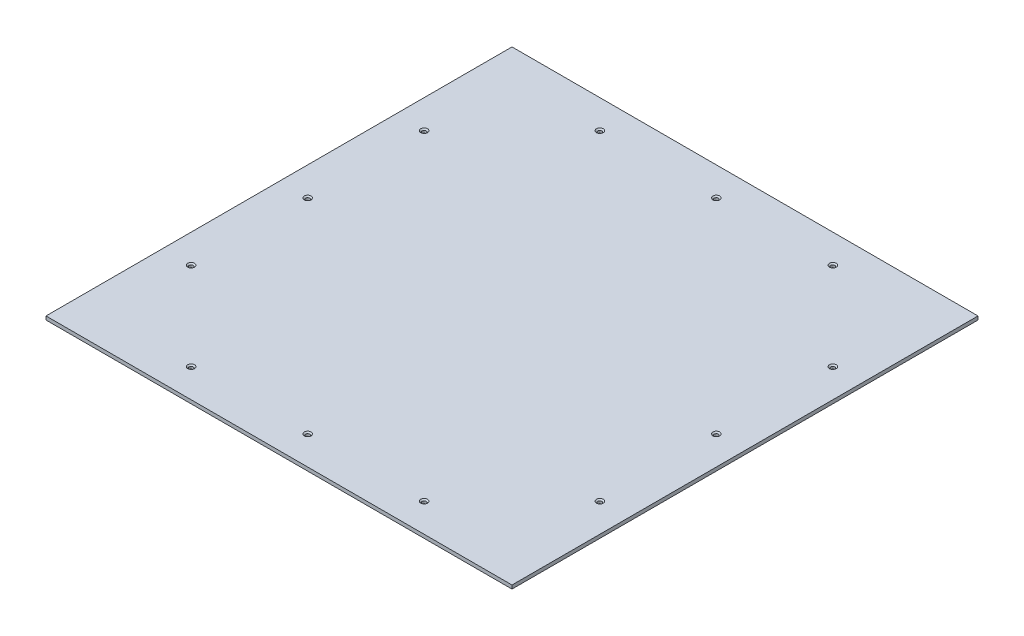
ISO-10303-21;
HEADER;
FILE_DESCRIPTION(('STEP AP214'),'2;1');
FILE_NAME('part.step','',(''),(''),'','','');
FILE_SCHEMA(('AUTOMOTIVE_DESIGN { 1 0 10303 214 1 1 1 1 }'));
ENDSEC;
DATA;
#1=APPLICATION_CONTEXT('core data for automotive mechanical design processes');
#2=APPLICATION_PROTOCOL_DEFINITION('international standard','automotive_design',2000,#1);
#3=PRODUCT_CONTEXT('',#1,'mechanical');
#4=PRODUCT('Part','Part','',(#3));
#5=PRODUCT_RELATED_PRODUCT_CATEGORY('part','',(#4));
#6=PRODUCT_DEFINITION_FORMATION('','',#4);
#7=PRODUCT_DEFINITION_CONTEXT('part definition',#1,'design');
#8=PRODUCT_DEFINITION('design','',#6,#7);
#9=PRODUCT_DEFINITION_SHAPE('','',#8);
#10=(LENGTH_UNIT() NAMED_UNIT(*) SI_UNIT(.MILLI.,.METRE.));
#11=(NAMED_UNIT(*) PLANE_ANGLE_UNIT() SI_UNIT($,.RADIAN.));
#12=(NAMED_UNIT(*) SI_UNIT($,.STERADIAN.) SOLID_ANGLE_UNIT());
#13=UNCERTAINTY_MEASURE_WITH_UNIT(LENGTH_MEASURE(1.E-05),#10,'distance_accuracy_value','');
#14=(GEOMETRIC_REPRESENTATION_CONTEXT(3) GLOBAL_UNCERTAINTY_ASSIGNED_CONTEXT((#13)) GLOBAL_UNIT_ASSIGNED_CONTEXT((#10,
#11,#12)) REPRESENTATION_CONTEXT('',''));
#15=CARTESIAN_POINT('',(0.,0.,0.));
#16=DIRECTION('',(0.,0.,1.));
#17=DIRECTION('',(1.,0.,0.));
#18=AXIS2_PLACEMENT_3D('',#15,#16,#17);
#19=CARTESIAN_POINT('',(103.375714,114.488214,103.375714));
#20=DIRECTION('',(1.,0.,0.));
#21=DIRECTION('',(0.,0.,1.));
#22=AXIS2_PLACEMENT_3D('',#19,#20,#21);
#23=PLANE('',#22);
#24=DIRECTION('',(0.,0.,1.));
#25=VECTOR('',#24,1.);
#26=CARTESIAN_POINT('',(103.375714,112.900714,103.375714));
#27=LINE('',#26,#25);
#28=CARTESIAN_POINT('',(103.375714,112.900714,-103.375714));
#29=VERTEX_POINT('',#28);
#30=CARTESIAN_POINT('',(103.375714,112.900714,103.375714));
#31=VERTEX_POINT('',#30);
#32=EDGE_CURVE('E82',#29,#31,#27,.T.);
#33=ORIENTED_EDGE('',*,*,#32,.F.);
#34=DIRECTION('',(0.,-1.,0.));
#35=VECTOR('',#34,1.);
#36=CARTESIAN_POINT('',(103.375714,114.488214,-103.375714));
#37=LINE('',#36,#35);
#38=CARTESIAN_POINT('',(103.375714,114.488214,-103.375714));
#39=VERTEX_POINT('',#38);
#40=EDGE_CURVE('E11',#39,#29,#37,.T.);
#41=ORIENTED_EDGE('',*,*,#40,.F.);
#42=DIRECTION('',(0.,0.,1.));
#43=VECTOR('',#42,1.);
#44=CARTESIAN_POINT('',(103.375714,114.488214,103.375714));
#45=LINE('',#44,#43);
#46=CARTESIAN_POINT('',(103.375714,114.488214,103.375714));
#47=VERTEX_POINT('',#46);
#48=EDGE_CURVE('E75',#39,#47,#45,.T.);
#49=ORIENTED_EDGE('',*,*,#48,.T.);
#50=DIRECTION('',(0.,-1.,0.));
#51=VECTOR('',#50,1.);
#52=CARTESIAN_POINT('',(103.375714,114.488214,103.375714));
#53=LINE('',#52,#51);
#54=EDGE_CURVE('E20',#47,#31,#53,.T.);
#55=ORIENTED_EDGE('',*,*,#54,.T.);
#56=EDGE_LOOP('',(#33,#41,#49,#55));
#57=FACE_BOUND('',#56,.T.);
#58=ADVANCED_FACE('F17',(#57),#23,.T.);
#59=CARTESIAN_POINT('',(103.375714,114.488214,-103.375714));
#60=DIRECTION('',(0.,0.,-1.));
#61=DIRECTION('',(1.,0.,0.));
#62=AXIS2_PLACEMENT_3D('',#59,#60,#61);
#63=PLANE('',#62);
#64=DIRECTION('',(1.,0.,0.));
#65=VECTOR('',#64,1.);
#66=CARTESIAN_POINT('',(103.375714,112.900714,-103.375714));
#67=LINE('',#66,#65);
#68=CARTESIAN_POINT('',(-103.375714,112.900714,-103.375714));
#69=VERTEX_POINT('',#68);
#70=EDGE_CURVE('E77',#69,#29,#67,.T.);
#71=ORIENTED_EDGE('',*,*,#70,.F.);
#72=DIRECTION('',(0.,-1.,0.));
#73=VECTOR('',#72,1.);
#74=CARTESIAN_POINT('',(-103.375714,114.488214,-103.375714));
#75=LINE('',#74,#73);
#76=CARTESIAN_POINT('',(-103.375714,114.488214,-103.375714));
#77=VERTEX_POINT('',#76);
#78=EDGE_CURVE('E26',#77,#69,#75,.T.);
#79=ORIENTED_EDGE('',*,*,#78,.F.);
#80=DIRECTION('',(1.,0.,0.));
#81=VECTOR('',#80,1.);
#82=CARTESIAN_POINT('',(103.375714,114.488214,-103.375714));
#83=LINE('',#82,#81);
#84=EDGE_CURVE('E72',#77,#39,#83,.T.);
#85=ORIENTED_EDGE('',*,*,#84,.T.);
#86=ORIENTED_EDGE('',*,*,#40,.T.);
#87=EDGE_LOOP('',(#71,#79,#85,#86));
#88=FACE_BOUND('',#87,.T.);
#89=ADVANCED_FACE('F93',(#88),#63,.T.);
#90=CARTESIAN_POINT('',(-103.375714,114.488214,103.375714));
#91=DIRECTION('',(-1.,0.,0.));
#92=DIRECTION('',(0.,0.,-1.));
#93=AXIS2_PLACEMENT_3D('',#90,#91,#92);
#94=PLANE('',#93);
#95=DIRECTION('',(0.,0.,-1.));
#96=VECTOR('',#95,1.);
#97=CARTESIAN_POINT('',(-103.375714,112.900714,103.375714));
#98=LINE('',#97,#96);
#99=CARTESIAN_POINT('',(-103.375714,112.900714,103.375714));
#100=VERTEX_POINT('',#99);
#101=EDGE_CURVE('E67',#100,#69,#98,.T.);
#102=ORIENTED_EDGE('',*,*,#101,.F.);
#103=DIRECTION('',(0.,-1.,0.));
#104=VECTOR('',#103,1.);
#105=CARTESIAN_POINT('',(-103.375714,114.488214,103.375714));
#106=LINE('',#105,#104);
#107=CARTESIAN_POINT('',(-103.375714,114.488214,103.375714));
#108=VERTEX_POINT('',#107);
#109=EDGE_CURVE('E62',#108,#100,#106,.T.);
#110=ORIENTED_EDGE('',*,*,#109,.F.);
#111=DIRECTION('',(0.,0.,-1.));
#112=VECTOR('',#111,1.);
#113=CARTESIAN_POINT('',(-103.375714,114.488214,103.375714));
#114=LINE('',#113,#112);
#115=EDGE_CURVE('E65',#108,#77,#114,.T.);
#116=ORIENTED_EDGE('',*,*,#115,.T.);
#117=ORIENTED_EDGE('',*,*,#78,.T.);
#118=EDGE_LOOP('',(#102,#110,#116,#117));
#119=FACE_BOUND('',#118,.T.);
#120=ADVANCED_FACE('F64',(#119),#94,.T.);
#121=CARTESIAN_POINT('',(103.375714,114.488214,103.375714));
#122=DIRECTION('',(0.,0.,1.));
#123=DIRECTION('',(-1.,0.,0.));
#124=AXIS2_PLACEMENT_3D('',#121,#122,#123);
#125=PLANE('',#124);
#126=DIRECTION('',(-1.,0.,0.));
#127=VECTOR('',#126,1.);
#128=CARTESIAN_POINT('',(103.375714,112.900714,103.375714));
#129=LINE('',#128,#127);
#130=EDGE_CURVE('E85',#31,#100,#129,.T.);
#131=ORIENTED_EDGE('',*,*,#130,.F.);
#132=ORIENTED_EDGE('',*,*,#54,.F.);
#133=DIRECTION('',(-1.,0.,0.));
#134=VECTOR('',#133,1.);
#135=CARTESIAN_POINT('',(103.375714,114.488214,103.375714));
#136=LINE('',#135,#134);
#137=EDGE_CURVE('E71',#47,#108,#136,.T.);
#138=ORIENTED_EDGE('',*,*,#137,.T.);
#139=ORIENTED_EDGE('',*,*,#109,.T.);
#140=EDGE_LOOP('',(#131,#132,#138,#139));
#141=FACE_BOUND('',#140,.T.);
#142=ADVANCED_FACE('F74',(#141),#125,.T.);
#143=CARTESIAN_POINT('',(103.375714,114.488214,-103.375714));
#144=DIRECTION('',(0.,1.,0.));
#145=DIRECTION('',(0.,0.,-1.));
#146=AXIS2_PLACEMENT_3D('',#143,#144,#145);
#147=PLANE('',#146);
#148=CARTESIAN_POINT('',(-90.6757140000005,114.488214,51.6878569999991));
#149=DIRECTION('',(0.,1.,0.));
#150=DIRECTION('',(0.,0.,-1.));
#151=AXIS2_PLACEMENT_3D('',#148,#149,#150);
#152=CIRCLE('',#151,1.51130000000001);
#153=CARTESIAN_POINT('',(-90.6757140000005,114.488214,50.1765569999991));
#154=VERTEX_POINT('',#153);
#155=EDGE_CURVE('E222',#154,#154,#152,.T.);
#156=ORIENTED_EDGE('',*,*,#155,.F.);
#157=EDGE_LOOP('',(#156));
#158=FACE_BOUND('',#157,.T.);
#159=CARTESIAN_POINT('',(-90.675714,114.488214,-9.36190769008373E-13));
#160=DIRECTION('',(0.,1.,0.));
#161=DIRECTION('',(0.,0.,-1.));
#162=AXIS2_PLACEMENT_3D('',#159,#160,#161);
#163=CIRCLE('',#162,1.51129999999999);
#164=CARTESIAN_POINT('',(-90.675714,114.488214,-1.51130000000093));
#165=VERTEX_POINT('',#164);
#166=EDGE_CURVE('E229',#165,#165,#163,.T.);
#167=ORIENTED_EDGE('',*,*,#166,.F.);
#168=EDGE_LOOP('',(#167));
#169=FACE_BOUND('',#168,.T.);
#170=CARTESIAN_POINT('',(-90.6757139999995,114.488214,-51.687857000001));
#171=DIRECTION('',(0.,1.,0.));
#172=DIRECTION('',(0.,0.,-1.));
#173=AXIS2_PLACEMENT_3D('',#170,#171,#172);
#174=CIRCLE('',#173,1.51129999999999);
#175=CARTESIAN_POINT('',(-90.6757139999995,114.488214,-53.1991570000009));
#176=VERTEX_POINT('',#175);
#177=EDGE_CURVE('E238',#176,#176,#174,.T.);
#178=ORIENTED_EDGE('',*,*,#177,.F.);
#179=EDGE_LOOP('',(#178));
#180=FACE_BOUND('',#179,.T.);
#181=CARTESIAN_POINT('',(51.6878569999994,114.488214,90.6757140000004));
#182=DIRECTION('',(0.,1.,0.));
#183=DIRECTION('',(0.,0.,-1.));
#184=AXIS2_PLACEMENT_3D('',#181,#182,#183);
#185=CIRCLE('',#184,1.5113);
#186=CARTESIAN_POINT('',(51.6878569999994,114.488214,89.1644140000004));
#187=VERTEX_POINT('',#186);
#188=EDGE_CURVE('E247',#187,#187,#185,.T.);
#189=ORIENTED_EDGE('',*,*,#188,.F.);
#190=EDGE_LOOP('',(#189));
#191=FACE_BOUND('',#190,.T.);
#192=CARTESIAN_POINT('',(-6.1959802232066E-13,114.488214,90.675714));
#193=DIRECTION('',(0.,1.,0.));
#194=DIRECTION('',(0.,0.,-1.));
#195=AXIS2_PLACEMENT_3D('',#192,#193,#194);
#196=CIRCLE('',#195,1.5113);
#197=CARTESIAN_POINT('',(-6.1959802232066E-13,114.488214,89.164414));
#198=VERTEX_POINT('',#197);
#199=EDGE_CURVE('E256',#198,#198,#196,.T.);
#200=ORIENTED_EDGE('',*,*,#199,.F.);
#201=EDGE_LOOP('',(#200));
#202=FACE_BOUND('',#201,.T.);
#203=CARTESIAN_POINT('',(-51.6878570000006,114.488214,90.6757139999997));
#204=DIRECTION('',(0.,1.,0.));
#205=DIRECTION('',(0.,0.,-1.));
#206=AXIS2_PLACEMENT_3D('',#203,#204,#205);
#207=CIRCLE('',#206,1.5113);
#208=CARTESIAN_POINT('',(-51.6878570000006,114.488214,89.1644139999997));
#209=VERTEX_POINT('',#208);
#210=EDGE_CURVE('E265',#209,#209,#207,.T.);
#211=ORIENTED_EDGE('',*,*,#210,.F.);
#212=EDGE_LOOP('',(#211));
#213=FACE_BOUND('',#212,.T.);
#214=CARTESIAN_POINT('',(90.6757140000002,114.488214,-51.6878569999997));
#215=DIRECTION('',(0.,1.,0.));
#216=DIRECTION('',(0.,0.,-1.));
#217=AXIS2_PLACEMENT_3D('',#214,#215,#216);
#218=CIRCLE('',#217,1.51130000000001);
#219=CARTESIAN_POINT('',(90.6757140000002,114.488214,-53.1991569999997));
#220=VERTEX_POINT('',#219);
#221=EDGE_CURVE('E274',#220,#220,#218,.T.);
#222=ORIENTED_EDGE('',*,*,#221,.F.);
#223=EDGE_LOOP('',(#222));
#224=FACE_BOUND('',#223,.T.);
#225=CARTESIAN_POINT('',(90.675714,114.488214,3.03005275632947E-13));
#226=DIRECTION('',(0.,1.,0.));
#227=DIRECTION('',(0.,0.,-1.));
#228=AXIS2_PLACEMENT_3D('',#225,#226,#227);
#229=CIRCLE('',#228,1.51129999999999);
#230=CARTESIAN_POINT('',(90.675714,114.488214,-1.51129999999969));
#231=VERTEX_POINT('',#230);
#232=EDGE_CURVE('E283',#231,#231,#229,.T.);
#233=ORIENTED_EDGE('',*,*,#232,.F.);
#234=EDGE_LOOP('',(#233));
#235=FACE_BOUND('',#234,.T.);
#236=CARTESIAN_POINT('',(90.6757139999998,114.488214,51.6878570000003));
#237=DIRECTION('',(0.,1.,0.));
#238=DIRECTION('',(0.,0.,-1.));
#239=AXIS2_PLACEMENT_3D('',#236,#237,#238);
#240=CIRCLE('',#239,1.51129999999999);
#241=CARTESIAN_POINT('',(90.6757139999998,114.488214,50.1765570000003));
#242=VERTEX_POINT('',#241);
#243=EDGE_CURVE('E292',#242,#242,#240,.T.);
#244=ORIENTED_EDGE('',*,*,#243,.F.);
#245=EDGE_LOOP('',(#244));
#246=FACE_BOUND('',#245,.T.);
#247=CARTESIAN_POINT('',(-51.687857,114.488214,-90.675714));
#248=DIRECTION('',(0.,1.,0.));
#249=DIRECTION('',(0.,0.,-1.));
#250=AXIS2_PLACEMENT_3D('',#247,#248,#249);
#251=CIRCLE('',#250,1.5113);
#252=CARTESIAN_POINT('',(-51.687857,114.488214,-92.187014));
#253=VERTEX_POINT('',#252);
#254=EDGE_CURVE('E301',#253,#253,#251,.T.);
#255=ORIENTED_EDGE('',*,*,#254,.F.);
#256=EDGE_LOOP('',(#255));
#257=FACE_BOUND('',#256,.T.);
#258=CARTESIAN_POINT('',(0.,114.488214,-90.675714));
#259=DIRECTION('',(0.,1.,0.));
#260=DIRECTION('',(0.,0.,-1.));
#261=AXIS2_PLACEMENT_3D('',#258,#259,#260);
#262=CIRCLE('',#261,1.5113);
#263=CARTESIAN_POINT('',(0.,114.488214,-92.187014));
#264=VERTEX_POINT('',#263);
#265=EDGE_CURVE('E310',#264,#264,#262,.T.);
#266=ORIENTED_EDGE('',*,*,#265,.F.);
#267=EDGE_LOOP('',(#266));
#268=FACE_BOUND('',#267,.T.);
#269=CARTESIAN_POINT('',(51.687857,114.488214,-90.675714));
#270=DIRECTION('',(0.,1.,0.));
#271=DIRECTION('',(0.,0.,-1.));
#272=AXIS2_PLACEMENT_3D('',#269,#270,#271);
#273=CIRCLE('',#272,1.5113);
#274=CARTESIAN_POINT('',(51.687857,114.488214,-92.187014));
#275=VERTEX_POINT('',#274);
#276=EDGE_CURVE('E319',#275,#275,#273,.T.);
#277=ORIENTED_EDGE('',*,*,#276,.F.);
#278=EDGE_LOOP('',(#277));
#279=FACE_BOUND('',#278,.T.);
#280=ORIENTED_EDGE('',*,*,#48,.F.);
#281=ORIENTED_EDGE('',*,*,#84,.F.);
#282=ORIENTED_EDGE('',*,*,#115,.F.);
#283=ORIENTED_EDGE('',*,*,#137,.F.);
#284=EDGE_LOOP('',(#280,#281,#282,#283));
#285=FACE_BOUND('',#284,.T.);
#286=ADVANCED_FACE('F70',(#158,#169,#180,#191,#202,#213,#224,#235,#246,#257,#268,#279,#285),
#147,.T.);
#287=CARTESIAN_POINT('',(103.375714,112.900714,-103.375714));
#288=DIRECTION('',(0.,1.,0.));
#289=DIRECTION('',(0.,0.,-1.));
#290=AXIS2_PLACEMENT_3D('',#287,#288,#289);
#291=PLANE('',#290);
#292=CARTESIAN_POINT('',(-90.6757140000005,112.900714,51.6878569999991));
#293=DIRECTION('',(0.,1.,0.));
#294=DIRECTION('',(0.,0.,-1.));
#295=AXIS2_PLACEMENT_3D('',#292,#293,#294);
#296=CIRCLE('',#295,0.889000000000001);
#297=CARTESIAN_POINT('',(-90.6757140000005,112.900714,50.7988569999991));
#298=VERTEX_POINT('',#297);
#299=EDGE_CURVE('E224',#298,#298,#296,.T.);
#300=ORIENTED_EDGE('',*,*,#299,.T.);
#301=EDGE_LOOP('',(#300));
#302=FACE_BOUND('',#301,.T.);
#303=CARTESIAN_POINT('',(-90.675714,112.900714,-9.36190769008373E-13));
#304=DIRECTION('',(0.,1.,0.));
#305=DIRECTION('',(0.,0.,-1.));
#306=AXIS2_PLACEMENT_3D('',#303,#304,#305);
#307=CIRCLE('',#306,0.889000000000001);
#308=CARTESIAN_POINT('',(-90.675714,112.900714,-0.889000000000937));
#309=VERTEX_POINT('',#308);
#310=EDGE_CURVE('E235',#309,#309,#307,.T.);
#311=ORIENTED_EDGE('',*,*,#310,.T.);
#312=EDGE_LOOP('',(#311));
#313=FACE_BOUND('',#312,.T.);
#314=CARTESIAN_POINT('',(-90.6757139999995,112.900714,-51.687857000001));
#315=DIRECTION('',(0.,1.,0.));
#316=DIRECTION('',(0.,0.,-1.));
#317=AXIS2_PLACEMENT_3D('',#314,#315,#316);
#318=CIRCLE('',#317,0.889000000000001);
#319=CARTESIAN_POINT('',(-90.6757139999995,112.900714,-52.576857000001));
#320=VERTEX_POINT('',#319);
#321=EDGE_CURVE('E244',#320,#320,#318,.T.);
#322=ORIENTED_EDGE('',*,*,#321,.T.);
#323=EDGE_LOOP('',(#322));
#324=FACE_BOUND('',#323,.T.);
#325=CARTESIAN_POINT('',(51.6878569999994,112.900714,90.6757140000004));
#326=DIRECTION('',(0.,1.,0.));
#327=DIRECTION('',(0.,0.,-1.));
#328=AXIS2_PLACEMENT_3D('',#325,#326,#327);
#329=CIRCLE('',#328,0.889000000000001);
#330=CARTESIAN_POINT('',(51.6878569999994,112.900714,89.7867140000004));
#331=VERTEX_POINT('',#330);
#332=EDGE_CURVE('E253',#331,#331,#329,.T.);
#333=ORIENTED_EDGE('',*,*,#332,.T.);
#334=EDGE_LOOP('',(#333));
#335=FACE_BOUND('',#334,.T.);
#336=CARTESIAN_POINT('',(-6.1959802232066E-13,112.900714,90.675714));
#337=DIRECTION('',(0.,1.,0.));
#338=DIRECTION('',(0.,0.,-1.));
#339=AXIS2_PLACEMENT_3D('',#336,#337,#338);
#340=CIRCLE('',#339,0.889);
#341=CARTESIAN_POINT('',(-6.1959802232066E-13,112.900714,89.786714));
#342=VERTEX_POINT('',#341);
#343=EDGE_CURVE('E262',#342,#342,#340,.T.);
#344=ORIENTED_EDGE('',*,*,#343,.T.);
#345=EDGE_LOOP('',(#344));
#346=FACE_BOUND('',#345,.T.);
#347=CARTESIAN_POINT('',(-51.6878570000006,112.900714,90.6757139999997));
#348=DIRECTION('',(0.,1.,0.));
#349=DIRECTION('',(0.,0.,-1.));
#350=AXIS2_PLACEMENT_3D('',#347,#348,#349);
#351=CIRCLE('',#350,0.889000000000001);
#352=CARTESIAN_POINT('',(-51.6878570000006,112.900714,89.7867139999997));
#353=VERTEX_POINT('',#352);
#354=EDGE_CURVE('E271',#353,#353,#351,.T.);
#355=ORIENTED_EDGE('',*,*,#354,.T.);
#356=EDGE_LOOP('',(#355));
#357=FACE_BOUND('',#356,.T.);
#358=CARTESIAN_POINT('',(90.6757140000002,112.900714,-51.6878569999997));
#359=DIRECTION('',(0.,1.,0.));
#360=DIRECTION('',(0.,0.,-1.));
#361=AXIS2_PLACEMENT_3D('',#358,#359,#360);
#362=CIRCLE('',#361,0.889000000000001);
#363=CARTESIAN_POINT('',(90.6757140000002,112.900714,-52.5768569999997));
#364=VERTEX_POINT('',#363);
#365=EDGE_CURVE('E280',#364,#364,#362,.T.);
#366=ORIENTED_EDGE('',*,*,#365,.T.);
#367=EDGE_LOOP('',(#366));
#368=FACE_BOUND('',#367,.T.);
#369=CARTESIAN_POINT('',(90.675714,112.900714,3.03005275632947E-13));
#370=DIRECTION('',(0.,1.,0.));
#371=DIRECTION('',(0.,0.,-1.));
#372=AXIS2_PLACEMENT_3D('',#369,#370,#371);
#373=CIRCLE('',#372,0.889000000000001);
#374=CARTESIAN_POINT('',(90.675714,112.900714,-0.888999999999698));
#375=VERTEX_POINT('',#374);
#376=EDGE_CURVE('E289',#375,#375,#373,.T.);
#377=ORIENTED_EDGE('',*,*,#376,.T.);
#378=EDGE_LOOP('',(#377));
#379=FACE_BOUND('',#378,.T.);
#380=CARTESIAN_POINT('',(90.6757139999998,112.900714,51.6878570000003));
#381=DIRECTION('',(0.,1.,0.));
#382=DIRECTION('',(0.,0.,-1.));
#383=AXIS2_PLACEMENT_3D('',#380,#381,#382);
#384=CIRCLE('',#383,0.889000000000001);
#385=CARTESIAN_POINT('',(90.6757139999998,112.900714,50.7988570000003));
#386=VERTEX_POINT('',#385);
#387=EDGE_CURVE('E298',#386,#386,#384,.T.);
#388=ORIENTED_EDGE('',*,*,#387,.T.);
#389=EDGE_LOOP('',(#388));
#390=FACE_BOUND('',#389,.T.);
#391=CARTESIAN_POINT('',(-51.687857,112.900714,-90.675714));
#392=DIRECTION('',(0.,1.,0.));
#393=DIRECTION('',(0.,0.,-1.));
#394=AXIS2_PLACEMENT_3D('',#391,#392,#393);
#395=CIRCLE('',#394,0.889000000000001);
#396=CARTESIAN_POINT('',(-51.687857,112.900714,-91.564714));
#397=VERTEX_POINT('',#396);
#398=EDGE_CURVE('E307',#397,#397,#395,.T.);
#399=ORIENTED_EDGE('',*,*,#398,.T.);
#400=EDGE_LOOP('',(#399));
#401=FACE_BOUND('',#400,.T.);
#402=CARTESIAN_POINT('',(0.,112.900714,-90.675714));
#403=DIRECTION('',(0.,1.,0.));
#404=DIRECTION('',(0.,0.,-1.));
#405=AXIS2_PLACEMENT_3D('',#402,#403,#404);
#406=CIRCLE('',#405,0.889);
#407=CARTESIAN_POINT('',(0.,112.900714,-91.564714));
#408=VERTEX_POINT('',#407);
#409=EDGE_CURVE('E316',#408,#408,#406,.T.);
#410=ORIENTED_EDGE('',*,*,#409,.T.);
#411=EDGE_LOOP('',(#410));
#412=FACE_BOUND('',#411,.T.);
#413=CARTESIAN_POINT('',(51.687857,112.900714,-90.675714));
#414=DIRECTION('',(0.,1.,0.));
#415=DIRECTION('',(0.,0.,-1.));
#416=AXIS2_PLACEMENT_3D('',#413,#414,#415);
#417=CIRCLE('',#416,0.889000000000001);
#418=CARTESIAN_POINT('',(51.687857,112.900714,-91.564714));
#419=VERTEX_POINT('',#418);
#420=EDGE_CURVE('E86',#419,#419,#417,.T.);
#421=ORIENTED_EDGE('',*,*,#420,.T.);
#422=EDGE_LOOP('',(#421));
#423=FACE_BOUND('',#422,.T.);
#424=ORIENTED_EDGE('',*,*,#32,.T.);
#425=ORIENTED_EDGE('',*,*,#130,.T.);
#426=ORIENTED_EDGE('',*,*,#101,.T.);
#427=ORIENTED_EDGE('',*,*,#70,.T.);
#428=EDGE_LOOP('',(#424,#425,#426,#427));
#429=FACE_BOUND('',#428,.T.);
#430=ADVANCED_FACE('F92',(#302,#313,#324,#335,#346,#357,#368,#379,#390,#401,#412,#423,#429),
#291,.F.);
#431=CARTESIAN_POINT('',(51.687857,114.488214,-90.675714));
#432=DIRECTION('',(0.,1.,0.));
#433=DIRECTION('',(0.,0.,-1.));
#434=AXIS2_PLACEMENT_3D('',#431,#432,#433);
#435=CYLINDRICAL_SURFACE('',#434,0.888999999999997);
#436=ORIENTED_EDGE('',*,*,#420,.F.);
#437=EDGE_LOOP('',(#436));
#438=FACE_BOUND('',#437,.T.);
#439=CARTESIAN_POINT('',(51.687857,113.966042299518,-90.675714));
#440=DIRECTION('',(0.,1.,0.));
#441=DIRECTION('',(0.,0.,-1.));
#442=AXIS2_PLACEMENT_3D('',#439,#440,#441);
#443=CIRCLE('',#442,0.888999999999994);
#444=CARTESIAN_POINT('',(51.687857,113.966042299518,-91.564714));
#445=VERTEX_POINT('',#444);
#446=EDGE_CURVE('E322',#445,#445,#443,.T.);
#447=ORIENTED_EDGE('',*,*,#446,.T.);
#448=EDGE_LOOP('',(#447));
#449=FACE_BOUND('',#448,.T.);
#450=ADVANCED_FACE('F115',(#438,#449),#435,.F.);
#451=CARTESIAN_POINT('',(51.687857,114.488214,-90.675714));
#452=DIRECTION('',(0.,1.,0.));
#453=DIRECTION('',(0.,0.,-1.));
#454=AXIS2_PLACEMENT_3D('',#451,#452,#453);
#455=CONICAL_SURFACE('',#454,1.5113,0.872664625997172);
#456=ORIENTED_EDGE('',*,*,#446,.F.);
#457=EDGE_LOOP('',(#456));
#458=FACE_BOUND('',#457,.T.);
#459=ORIENTED_EDGE('',*,*,#276,.T.);
#460=EDGE_LOOP('',(#459));
#461=FACE_BOUND('',#460,.T.);
#462=ADVANCED_FACE('F122',(#458,#461),#455,.F.);
#463=CARTESIAN_POINT('',(0.,114.488214,-90.675714));
#464=DIRECTION('',(0.,1.,0.));
#465=DIRECTION('',(0.,0.,-1.));
#466=AXIS2_PLACEMENT_3D('',#463,#464,#465);
#467=CYLINDRICAL_SURFACE('',#466,0.888999999999998);
#468=ORIENTED_EDGE('',*,*,#409,.F.);
#469=EDGE_LOOP('',(#468));
#470=FACE_BOUND('',#469,.T.);
#471=CARTESIAN_POINT('',(0.,113.966042299518,-90.675714));
#472=DIRECTION('',(0.,1.,0.));
#473=DIRECTION('',(0.,0.,-1.));
#474=AXIS2_PLACEMENT_3D('',#471,#472,#473);
#475=CIRCLE('',#474,0.888999999999997);
#476=CARTESIAN_POINT('',(0.,113.966042299518,-91.564714));
#477=VERTEX_POINT('',#476);
#478=EDGE_CURVE('E313',#477,#477,#475,.T.);
#479=ORIENTED_EDGE('',*,*,#478,.T.);
#480=EDGE_LOOP('',(#479));
#481=FACE_BOUND('',#480,.T.);
#482=ADVANCED_FACE('F126',(#470,#481),#467,.F.);
#483=CARTESIAN_POINT('',(0.,114.488214,-90.675714));
#484=DIRECTION('',(0.,1.,0.));
#485=DIRECTION('',(0.,0.,-1.));
#486=AXIS2_PLACEMENT_3D('',#483,#484,#485);
#487=CONICAL_SURFACE('',#486,1.5113,0.87266462599717);
#488=ORIENTED_EDGE('',*,*,#478,.F.);
#489=EDGE_LOOP('',(#488));
#490=FACE_BOUND('',#489,.T.);
#491=ORIENTED_EDGE('',*,*,#265,.T.);
#492=EDGE_LOOP('',(#491));
#493=FACE_BOUND('',#492,.T.);
#494=ADVANCED_FACE('F130',(#490,#493),#487,.F.);
#495=CARTESIAN_POINT('',(-51.687857,114.488214,-90.675714));
#496=DIRECTION('',(0.,1.,0.));
#497=DIRECTION('',(0.,0.,-1.));
#498=AXIS2_PLACEMENT_3D('',#495,#496,#497);
#499=CYLINDRICAL_SURFACE('',#498,0.888999999999997);
#500=ORIENTED_EDGE('',*,*,#398,.F.);
#501=EDGE_LOOP('',(#500));
#502=FACE_BOUND('',#501,.T.);
#503=CARTESIAN_POINT('',(-51.687857,113.966042299518,-90.675714));
#504=DIRECTION('',(0.,1.,0.));
#505=DIRECTION('',(0.,0.,-1.));
#506=AXIS2_PLACEMENT_3D('',#503,#504,#505);
#507=CIRCLE('',#506,0.888999999999994);
#508=CARTESIAN_POINT('',(-51.687857,113.966042299518,-91.564714));
#509=VERTEX_POINT('',#508);
#510=EDGE_CURVE('E304',#509,#509,#507,.T.);
#511=ORIENTED_EDGE('',*,*,#510,.T.);
#512=EDGE_LOOP('',(#511));
#513=FACE_BOUND('',#512,.T.);
#514=ADVANCED_FACE('F134',(#502,#513),#499,.F.);
#515=CARTESIAN_POINT('',(-51.687857,114.488214,-90.675714));
#516=DIRECTION('',(0.,1.,0.));
#517=DIRECTION('',(0.,0.,-1.));
#518=AXIS2_PLACEMENT_3D('',#515,#516,#517);
#519=CONICAL_SURFACE('',#518,1.5113,0.872664625997172);
#520=ORIENTED_EDGE('',*,*,#510,.F.);
#521=EDGE_LOOP('',(#520));
#522=FACE_BOUND('',#521,.T.);
#523=ORIENTED_EDGE('',*,*,#254,.T.);
#524=EDGE_LOOP('',(#523));
#525=FACE_BOUND('',#524,.T.);
#526=ADVANCED_FACE('F138',(#522,#525),#519,.F.);
#527=CARTESIAN_POINT('',(90.6757139999998,114.488214,51.6878570000003));
#528=DIRECTION('',(0.,1.,0.));
#529=DIRECTION('',(0.,0.,-1.));
#530=AXIS2_PLACEMENT_3D('',#527,#528,#529);
#531=CYLINDRICAL_SURFACE('',#530,0.889000000000001);
#532=ORIENTED_EDGE('',*,*,#387,.F.);
#533=EDGE_LOOP('',(#532));
#534=FACE_BOUND('',#533,.T.);
#535=CARTESIAN_POINT('',(90.6757139999998,113.966042299518,51.6878570000003));
#536=DIRECTION('',(0.,1.,0.));
#537=DIRECTION('',(0.,0.,-1.));
#538=AXIS2_PLACEMENT_3D('',#535,#536,#537);
#539=CIRCLE('',#538,0.889000000000001);
#540=CARTESIAN_POINT('',(90.6757139999998,113.966042299518,50.7988570000003));
#541=VERTEX_POINT('',#540);
#542=EDGE_CURVE('E295',#541,#541,#539,.T.);
#543=ORIENTED_EDGE('',*,*,#542,.T.);
#544=EDGE_LOOP('',(#543));
#545=FACE_BOUND('',#544,.T.);
#546=ADVANCED_FACE('F142',(#534,#545),#531,.F.);
#547=CARTESIAN_POINT('',(90.6757139999998,114.488214,51.6878570000003));
#548=DIRECTION('',(0.,1.,0.));
#549=DIRECTION('',(0.,0.,-1.));
#550=AXIS2_PLACEMENT_3D('',#547,#548,#549);
#551=CONICAL_SURFACE('',#550,1.51129999999999,0.872664625997161);
#552=ORIENTED_EDGE('',*,*,#542,.F.);
#553=EDGE_LOOP('',(#552));
#554=FACE_BOUND('',#553,.T.);
#555=ORIENTED_EDGE('',*,*,#243,.T.);
#556=EDGE_LOOP('',(#555));
#557=FACE_BOUND('',#556,.T.);
#558=ADVANCED_FACE('F146',(#554,#557),#551,.F.);
#559=CARTESIAN_POINT('',(90.675714,114.488214,3.03005275632947E-13));
#560=DIRECTION('',(0.,1.,0.));
#561=DIRECTION('',(0.,0.,-1.));
#562=AXIS2_PLACEMENT_3D('',#559,#560,#561);
#563=CYLINDRICAL_SURFACE('',#562,0.889000000000001);
#564=ORIENTED_EDGE('',*,*,#376,.F.);
#565=EDGE_LOOP('',(#564));
#566=FACE_BOUND('',#565,.T.);
#567=CARTESIAN_POINT('',(90.675714,113.966042299518,3.03005275632947E-13));
#568=DIRECTION('',(0.,1.,0.));
#569=DIRECTION('',(0.,0.,-1.));
#570=AXIS2_PLACEMENT_3D('',#567,#568,#569);
#571=CIRCLE('',#570,0.889000000000001);
#572=CARTESIAN_POINT('',(90.675714,113.966042299518,-0.888999999999698));
#573=VERTEX_POINT('',#572);
#574=EDGE_CURVE('E286',#573,#573,#571,.T.);
#575=ORIENTED_EDGE('',*,*,#574,.T.);
#576=EDGE_LOOP('',(#575));
#577=FACE_BOUND('',#576,.T.);
#578=ADVANCED_FACE('F150',(#566,#577),#563,.F.);
#579=CARTESIAN_POINT('',(90.675714,114.488214,3.03005275632947E-13));
#580=DIRECTION('',(0.,1.,0.));
#581=DIRECTION('',(0.,0.,-1.));
#582=AXIS2_PLACEMENT_3D('',#579,#580,#581);
#583=CONICAL_SURFACE('',#582,1.51129999999999,0.872664625997161);
#584=ORIENTED_EDGE('',*,*,#574,.F.);
#585=EDGE_LOOP('',(#584));
#586=FACE_BOUND('',#585,.T.);
#587=ORIENTED_EDGE('',*,*,#232,.T.);
#588=EDGE_LOOP('',(#587));
#589=FACE_BOUND('',#588,.T.);
#590=ADVANCED_FACE('F154',(#586,#589),#583,.F.);
#591=CARTESIAN_POINT('',(90.6757140000002,114.488214,-51.6878569999997));
#592=DIRECTION('',(0.,1.,0.));
#593=DIRECTION('',(0.,0.,-1.));
#594=AXIS2_PLACEMENT_3D('',#591,#592,#593);
#595=CYLINDRICAL_SURFACE('',#594,0.889000000000001);
#596=ORIENTED_EDGE('',*,*,#365,.F.);
#597=EDGE_LOOP('',(#596));
#598=FACE_BOUND('',#597,.T.);
#599=CARTESIAN_POINT('',(90.6757140000002,113.966042299518,-51.6878569999997));
#600=DIRECTION('',(0.,1.,0.));
#601=DIRECTION('',(0.,0.,-1.));
#602=AXIS2_PLACEMENT_3D('',#599,#600,#601);
#603=CIRCLE('',#602,0.889000000000001);
#604=CARTESIAN_POINT('',(90.6757140000002,113.966042299518,-52.5768569999997));
#605=VERTEX_POINT('',#604);
#606=EDGE_CURVE('E277',#605,#605,#603,.T.);
#607=ORIENTED_EDGE('',*,*,#606,.T.);
#608=EDGE_LOOP('',(#607));
#609=FACE_BOUND('',#608,.T.);
#610=ADVANCED_FACE('F158',(#598,#609),#595,.F.);
#611=CARTESIAN_POINT('',(90.6757140000002,114.488214,-51.6878569999997));
#612=DIRECTION('',(0.,1.,0.));
#613=DIRECTION('',(0.,0.,-1.));
#614=AXIS2_PLACEMENT_3D('',#611,#612,#613);
#615=CONICAL_SURFACE('',#614,1.51130000000001,0.872664625997172);
#616=ORIENTED_EDGE('',*,*,#606,.F.);
#617=EDGE_LOOP('',(#616));
#618=FACE_BOUND('',#617,.T.);
#619=ORIENTED_EDGE('',*,*,#221,.T.);
#620=EDGE_LOOP('',(#619));
#621=FACE_BOUND('',#620,.T.);
#622=ADVANCED_FACE('F162',(#618,#621),#615,.F.);
#623=CARTESIAN_POINT('',(-51.6878570000006,114.488214,90.6757139999997));
#624=DIRECTION('',(0.,1.,0.));
#625=DIRECTION('',(0.,0.,-1.));
#626=AXIS2_PLACEMENT_3D('',#623,#624,#625);
#627=CYLINDRICAL_SURFACE('',#626,0.888999999999997);
#628=ORIENTED_EDGE('',*,*,#354,.F.);
#629=EDGE_LOOP('',(#628));
#630=FACE_BOUND('',#629,.T.);
#631=CARTESIAN_POINT('',(-51.6878570000006,113.966042299518,90.6757139999997));
#632=DIRECTION('',(0.,1.,0.));
#633=DIRECTION('',(0.,0.,-1.));
#634=AXIS2_PLACEMENT_3D('',#631,#632,#633);
#635=CIRCLE('',#634,0.888999999999994);
#636=CARTESIAN_POINT('',(-51.6878570000006,113.966042299518,89.7867139999997));
#637=VERTEX_POINT('',#636);
#638=EDGE_CURVE('E268',#637,#637,#635,.T.);
#639=ORIENTED_EDGE('',*,*,#638,.T.);
#640=EDGE_LOOP('',(#639));
#641=FACE_BOUND('',#640,.T.);
#642=ADVANCED_FACE('F166',(#630,#641),#627,.F.);
#643=CARTESIAN_POINT('',(-51.6878570000006,114.488214,90.6757139999997));
#644=DIRECTION('',(0.,1.,0.));
#645=DIRECTION('',(0.,0.,-1.));
#646=AXIS2_PLACEMENT_3D('',#643,#644,#645);
#647=CONICAL_SURFACE('',#646,1.5113,0.872664625997172);
#648=ORIENTED_EDGE('',*,*,#638,.F.);
#649=EDGE_LOOP('',(#648));
#650=FACE_BOUND('',#649,.T.);
#651=ORIENTED_EDGE('',*,*,#210,.T.);
#652=EDGE_LOOP('',(#651));
#653=FACE_BOUND('',#652,.T.);
#654=ADVANCED_FACE('F170',(#650,#653),#647,.F.);
#655=CARTESIAN_POINT('',(-6.1959802232066E-13,114.488214,90.675714));
#656=DIRECTION('',(0.,1.,0.));
#657=DIRECTION('',(0.,0.,-1.));
#658=AXIS2_PLACEMENT_3D('',#655,#656,#657);
#659=CYLINDRICAL_SURFACE('',#658,0.888999999999998);
#660=ORIENTED_EDGE('',*,*,#343,.F.);
#661=EDGE_LOOP('',(#660));
#662=FACE_BOUND('',#661,.T.);
#663=CARTESIAN_POINT('',(-6.1959802232066E-13,113.966042299518,90.675714));
#664=DIRECTION('',(0.,1.,0.));
#665=DIRECTION('',(0.,0.,-1.));
#666=AXIS2_PLACEMENT_3D('',#663,#664,#665);
#667=CIRCLE('',#666,0.888999999999997);
#668=CARTESIAN_POINT('',(-6.1959802232066E-13,113.966042299518,89.786714));
#669=VERTEX_POINT('',#668);
#670=EDGE_CURVE('E259',#669,#669,#667,.T.);
#671=ORIENTED_EDGE('',*,*,#670,.T.);
#672=EDGE_LOOP('',(#671));
#673=FACE_BOUND('',#672,.T.);
#674=ADVANCED_FACE('F174',(#662,#673),#659,.F.);
#675=CARTESIAN_POINT('',(-6.1959802232066E-13,114.488214,90.675714));
#676=DIRECTION('',(0.,1.,0.));
#677=DIRECTION('',(0.,0.,-1.));
#678=AXIS2_PLACEMENT_3D('',#675,#676,#677);
#679=CONICAL_SURFACE('',#678,1.5113,0.87266462599717);
#680=ORIENTED_EDGE('',*,*,#670,.F.);
#681=EDGE_LOOP('',(#680));
#682=FACE_BOUND('',#681,.T.);
#683=ORIENTED_EDGE('',*,*,#199,.T.);
#684=EDGE_LOOP('',(#683));
#685=FACE_BOUND('',#684,.T.);
#686=ADVANCED_FACE('F178',(#682,#685),#679,.F.);
#687=CARTESIAN_POINT('',(51.6878569999994,114.488214,90.6757140000004));
#688=DIRECTION('',(0.,1.,0.));
#689=DIRECTION('',(0.,0.,-1.));
#690=AXIS2_PLACEMENT_3D('',#687,#688,#689);
#691=CYLINDRICAL_SURFACE('',#690,0.888999999999997);
#692=ORIENTED_EDGE('',*,*,#332,.F.);
#693=EDGE_LOOP('',(#692));
#694=FACE_BOUND('',#693,.T.);
#695=CARTESIAN_POINT('',(51.6878569999994,113.966042299518,90.6757140000004));
#696=DIRECTION('',(0.,1.,0.));
#697=DIRECTION('',(0.,0.,-1.));
#698=AXIS2_PLACEMENT_3D('',#695,#696,#697);
#699=CIRCLE('',#698,0.888999999999994);
#700=CARTESIAN_POINT('',(51.6878569999994,113.966042299518,89.7867140000004));
#701=VERTEX_POINT('',#700);
#702=EDGE_CURVE('E250',#701,#701,#699,.T.);
#703=ORIENTED_EDGE('',*,*,#702,.T.);
#704=EDGE_LOOP('',(#703));
#705=FACE_BOUND('',#704,.T.);
#706=ADVANCED_FACE('F182',(#694,#705),#691,.F.);
#707=CARTESIAN_POINT('',(51.6878569999994,114.488214,90.6757140000004));
#708=DIRECTION('',(0.,1.,0.));
#709=DIRECTION('',(0.,0.,-1.));
#710=AXIS2_PLACEMENT_3D('',#707,#708,#709);
#711=CONICAL_SURFACE('',#710,1.5113,0.872664625997172);
#712=ORIENTED_EDGE('',*,*,#702,.F.);
#713=EDGE_LOOP('',(#712));
#714=FACE_BOUND('',#713,.T.);
#715=ORIENTED_EDGE('',*,*,#188,.T.);
#716=EDGE_LOOP('',(#715));
#717=FACE_BOUND('',#716,.T.);
#718=ADVANCED_FACE('F186',(#714,#717),#711,.F.);
#719=CARTESIAN_POINT('',(-90.6757139999995,114.488214,-51.687857000001));
#720=DIRECTION('',(0.,1.,0.));
#721=DIRECTION('',(0.,0.,-1.));
#722=AXIS2_PLACEMENT_3D('',#719,#720,#721);
#723=CYLINDRICAL_SURFACE('',#722,0.889000000000001);
#724=ORIENTED_EDGE('',*,*,#321,.F.);
#725=EDGE_LOOP('',(#724));
#726=FACE_BOUND('',#725,.T.);
#727=CARTESIAN_POINT('',(-90.6757139999995,113.966042299518,-51.687857000001));
#728=DIRECTION('',(0.,1.,0.));
#729=DIRECTION('',(0.,0.,-1.));
#730=AXIS2_PLACEMENT_3D('',#727,#728,#729);
#731=CIRCLE('',#730,0.889000000000001);
#732=CARTESIAN_POINT('',(-90.6757139999995,113.966042299518,-52.576857000001));
#733=VERTEX_POINT('',#732);
#734=EDGE_CURVE('E241',#733,#733,#731,.T.);
#735=ORIENTED_EDGE('',*,*,#734,.T.);
#736=EDGE_LOOP('',(#735));
#737=FACE_BOUND('',#736,.T.);
#738=ADVANCED_FACE('F190',(#726,#737),#723,.F.);
#739=CARTESIAN_POINT('',(-90.6757139999995,114.488214,-51.687857000001));
#740=DIRECTION('',(0.,1.,0.));
#741=DIRECTION('',(0.,0.,-1.));
#742=AXIS2_PLACEMENT_3D('',#739,#740,#741);
#743=CONICAL_SURFACE('',#742,1.51129999999999,0.872664625997161);
#744=ORIENTED_EDGE('',*,*,#734,.F.);
#745=EDGE_LOOP('',(#744));
#746=FACE_BOUND('',#745,.T.);
#747=ORIENTED_EDGE('',*,*,#177,.T.);
#748=EDGE_LOOP('',(#747));
#749=FACE_BOUND('',#748,.T.);
#750=ADVANCED_FACE('F194',(#746,#749),#743,.F.);
#751=CARTESIAN_POINT('',(-90.675714,114.488214,-9.36190769008373E-13));
#752=DIRECTION('',(0.,1.,0.));
#753=DIRECTION('',(0.,0.,-1.));
#754=AXIS2_PLACEMENT_3D('',#751,#752,#753);
#755=CYLINDRICAL_SURFACE('',#754,0.889000000000001);
#756=ORIENTED_EDGE('',*,*,#310,.F.);
#757=EDGE_LOOP('',(#756));
#758=FACE_BOUND('',#757,.T.);
#759=CARTESIAN_POINT('',(-90.675714,113.966042299518,-9.36190769008373E-13));
#760=DIRECTION('',(0.,1.,0.));
#761=DIRECTION('',(0.,0.,-1.));
#762=AXIS2_PLACEMENT_3D('',#759,#760,#761);
#763=CIRCLE('',#762,0.889000000000001);
#764=CARTESIAN_POINT('',(-90.675714,113.966042299518,-0.889000000000937));
#765=VERTEX_POINT('',#764);
#766=EDGE_CURVE('E232',#765,#765,#763,.T.);
#767=ORIENTED_EDGE('',*,*,#766,.T.);
#768=EDGE_LOOP('',(#767));
#769=FACE_BOUND('',#768,.T.);
#770=ADVANCED_FACE('F198',(#758,#769),#755,.F.);
#771=CARTESIAN_POINT('',(-90.675714,114.488214,-9.36190769008373E-13));
#772=DIRECTION('',(0.,1.,0.));
#773=DIRECTION('',(0.,0.,-1.));
#774=AXIS2_PLACEMENT_3D('',#771,#772,#773);
#775=CONICAL_SURFACE('',#774,1.51129999999999,0.872664625997161);
#776=ORIENTED_EDGE('',*,*,#766,.F.);
#777=EDGE_LOOP('',(#776));
#778=FACE_BOUND('',#777,.T.);
#779=ORIENTED_EDGE('',*,*,#166,.T.);
#780=EDGE_LOOP('',(#779));
#781=FACE_BOUND('',#780,.T.);
#782=ADVANCED_FACE('F202',(#778,#781),#775,.F.);
#783=CARTESIAN_POINT('',(-90.6757140000005,114.488214,51.6878569999991));
#784=DIRECTION('',(0.,1.,0.));
#785=DIRECTION('',(0.,0.,-1.));
#786=AXIS2_PLACEMENT_3D('',#783,#784,#785);
#787=CYLINDRICAL_SURFACE('',#786,0.889000000000001);
#788=ORIENTED_EDGE('',*,*,#299,.F.);
#789=EDGE_LOOP('',(#788));
#790=FACE_BOUND('',#789,.T.);
#791=CARTESIAN_POINT('',(-90.6757140000005,113.966042299518,51.6878569999991));
#792=DIRECTION('',(0.,1.,0.));
#793=DIRECTION('',(0.,0.,-1.));
#794=AXIS2_PLACEMENT_3D('',#791,#792,#793);
#795=CIRCLE('',#794,0.889000000000001);
#796=CARTESIAN_POINT('',(-90.6757140000005,113.966042299518,50.7988569999991));
#797=VERTEX_POINT('',#796);
#798=EDGE_CURVE('E220',#797,#797,#795,.T.);
#799=ORIENTED_EDGE('',*,*,#798,.T.);
#800=EDGE_LOOP('',(#799));
#801=FACE_BOUND('',#800,.T.);
#802=ADVANCED_FACE('F206',(#790,#801),#787,.F.);
#803=CARTESIAN_POINT('',(-90.6757140000005,114.488214,51.6878569999991));
#804=DIRECTION('',(0.,1.,0.));
#805=DIRECTION('',(0.,0.,-1.));
#806=AXIS2_PLACEMENT_3D('',#803,#804,#805);
#807=CONICAL_SURFACE('',#806,1.51130000000001,0.872664625997172);
#808=ORIENTED_EDGE('',*,*,#798,.F.);
#809=EDGE_LOOP('',(#808));
#810=FACE_BOUND('',#809,.T.);
#811=ORIENTED_EDGE('',*,*,#155,.T.);
#812=EDGE_LOOP('',(#811));
#813=FACE_BOUND('',#812,.T.);
#814=ADVANCED_FACE('F210',(#810,#813),#807,.F.);
#815=CLOSED_SHELL('',(#58,#89,#120,#142,#286,#430,#450,#462,#482,#494,#514,#526,#546,#558,#578,
#590,#610,#622,#642,#654,#674,#686,#706,#718,#738,#750,#770,#782,#802,#814));
#816=MANIFOLD_SOLID_BREP('B1',#815);
#817=ADVANCED_BREP_SHAPE_REPRESENTATION('',(#18,#816),#14);
#818=SHAPE_DEFINITION_REPRESENTATION(#9,#817);
ENDSEC;
END-ISO-10303-21;
